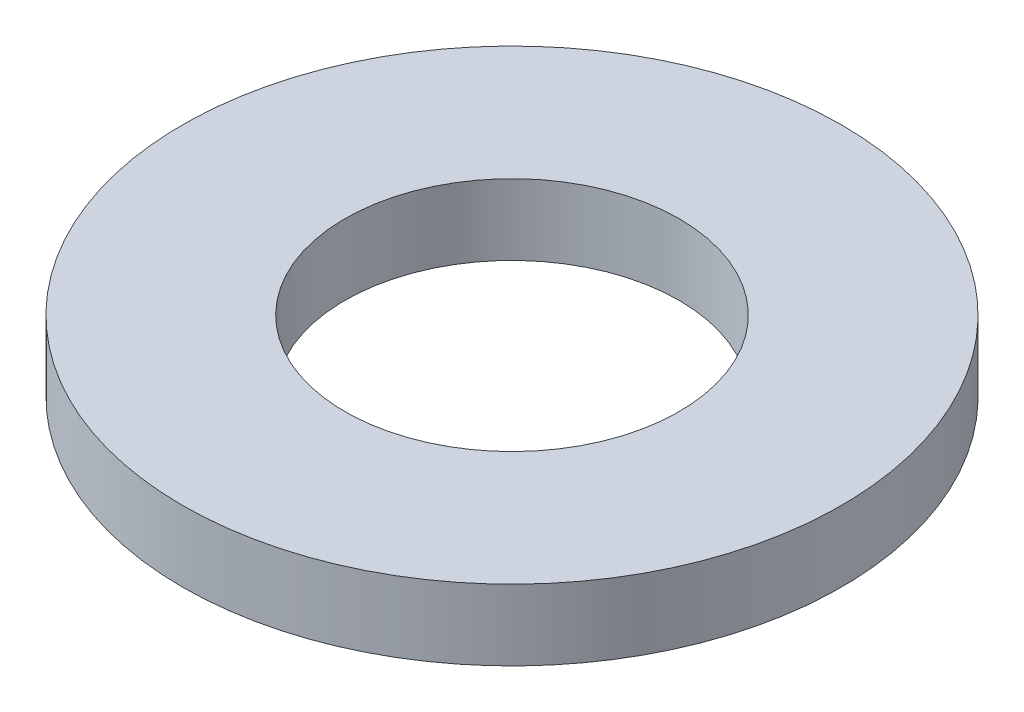
ISO-10303-21;
HEADER;
FILE_DESCRIPTION(('STEP AP214'),'2;1');
FILE_NAME('part.step','',(''),(''),'','','');
FILE_SCHEMA(('AUTOMOTIVE_DESIGN { 1 0 10303 214 1 1 1 1 }'));
ENDSEC;
DATA;
#1=APPLICATION_CONTEXT('core data for automotive mechanical design processes');
#2=APPLICATION_PROTOCOL_DEFINITION('international standard','automotive_design',2000,#1);
#3=PRODUCT_CONTEXT('',#1,'mechanical');
#4=PRODUCT('Part','Part','',(#3));
#5=PRODUCT_RELATED_PRODUCT_CATEGORY('part','',(#4));
#6=PRODUCT_DEFINITION_FORMATION('','',#4);
#7=PRODUCT_DEFINITION_CONTEXT('part definition',#1,'design');
#8=PRODUCT_DEFINITION('design','',#6,#7);
#9=PRODUCT_DEFINITION_SHAPE('','',#8);
#10=(LENGTH_UNIT() NAMED_UNIT(*) SI_UNIT(.MILLI.,.METRE.));
#11=(NAMED_UNIT(*) PLANE_ANGLE_UNIT() SI_UNIT($,.RADIAN.));
#12=(NAMED_UNIT(*) SI_UNIT($,.STERADIAN.) SOLID_ANGLE_UNIT());
#13=UNCERTAINTY_MEASURE_WITH_UNIT(LENGTH_MEASURE(1.E-05),#10,'distance_accuracy_value','');
#14=(GEOMETRIC_REPRESENTATION_CONTEXT(3) GLOBAL_UNCERTAINTY_ASSIGNED_CONTEXT((#13)) GLOBAL_UNIT_ASSIGNED_CONTEXT((#10,
#11,#12)) REPRESENTATION_CONTEXT('',''));
#15=CARTESIAN_POINT('',(0.,0.,0.));
#16=DIRECTION('',(0.,0.,1.));
#17=DIRECTION('',(1.,0.,0.));
#18=AXIS2_PLACEMENT_3D('',#15,#16,#17);
#19=CARTESIAN_POINT('',(0.,0.,0.));
#20=DIRECTION('',(0.,1.,0.));
#21=DIRECTION('',(0.,0.,1.));
#22=AXIS2_PLACEMENT_3D('',#19,#20,#21);
#23=PLANE('',#22);
#24=CARTESIAN_POINT('',(0.,0.,0.));
#25=DIRECTION('',(0.,-1.,0.));
#26=DIRECTION('',(0.,0.,-1.));
#27=AXIS2_PLACEMENT_3D('',#24,#25,#26);
#28=CIRCLE('',#27,2.03835);
#29=CARTESIAN_POINT('',(0.,0.,-2.03835));
#30=VERTEX_POINT('',#29);
#31=EDGE_CURVE('E27',#30,#30,#28,.F.);
#32=ORIENTED_EDGE('',*,*,#31,.T.);
#33=EDGE_LOOP('',(#32));
#34=FACE_BOUND('',#33,.T.);
#35=CARTESIAN_POINT('',(0.,0.,0.));
#36=DIRECTION('',(0.,-1.,0.));
#37=DIRECTION('',(0.,0.,-1.));
#38=AXIS2_PLACEMENT_3D('',#35,#36,#37);
#39=CIRCLE('',#38,4.01955);
#40=CARTESIAN_POINT('',(0.,0.,-4.01955));
#41=VERTEX_POINT('',#40);
#42=EDGE_CURVE('E18',#41,#41,#39,.F.);
#43=ORIENTED_EDGE('',*,*,#42,.F.);
#44=EDGE_LOOP('',(#43));
#45=FACE_BOUND('',#44,.T.);
#46=ADVANCED_FACE('F15',(#34,#45),#23,.F.);
#47=CARTESIAN_POINT('',(0.,0.8636,0.));
#48=DIRECTION('',(0.,-1.,0.));
#49=DIRECTION('',(0.,0.,-1.));
#50=AXIS2_PLACEMENT_3D('',#47,#48,#49);
#51=CYLINDRICAL_SURFACE('',#50,4.01955);
#52=ORIENTED_EDGE('',*,*,#42,.T.);
#53=EDGE_LOOP('',(#52));
#54=FACE_BOUND('',#53,.T.);
#55=CARTESIAN_POINT('',(0.,0.8636,0.));
#56=DIRECTION('',(0.,-1.,0.));
#57=DIRECTION('',(0.,0.,-1.));
#58=AXIS2_PLACEMENT_3D('',#55,#56,#57);
#59=CIRCLE('',#58,4.01955);
#60=CARTESIAN_POINT('',(0.,0.8636,-4.01955));
#61=VERTEX_POINT('',#60);
#62=EDGE_CURVE('E22',#61,#61,#59,.F.);
#63=ORIENTED_EDGE('',*,*,#62,.F.);
#64=EDGE_LOOP('',(#63));
#65=FACE_BOUND('',#64,.T.);
#66=ADVANCED_FACE('F35',(#54,#65),#51,.T.);
#67=CARTESIAN_POINT('',(0.,0.8636,0.));
#68=DIRECTION('',(0.,-1.,0.));
#69=DIRECTION('',(0.,0.,-1.));
#70=AXIS2_PLACEMENT_3D('',#67,#68,#69);
#71=CYLINDRICAL_SURFACE('',#70,2.03835);
#72=CARTESIAN_POINT('',(0.,0.8636,0.));
#73=DIRECTION('',(0.,-1.,0.));
#74=DIRECTION('',(0.,0.,-1.));
#75=AXIS2_PLACEMENT_3D('',#72,#73,#74);
#76=CIRCLE('',#75,2.03835);
#77=CARTESIAN_POINT('',(0.,0.8636,-2.03835));
#78=VERTEX_POINT('',#77);
#79=EDGE_CURVE('E10',#78,#78,#76,.T.);
#80=ORIENTED_EDGE('',*,*,#79,.F.);
#81=EDGE_LOOP('',(#80));
#82=FACE_BOUND('',#81,.T.);
#83=ORIENTED_EDGE('',*,*,#31,.F.);
#84=EDGE_LOOP('',(#83));
#85=FACE_BOUND('',#84,.T.);
#86=ADVANCED_FACE('F43',(#82,#85),#71,.F.);
#87=CARTESIAN_POINT('',(0.,0.8636,0.));
#88=DIRECTION('',(0.,1.,0.));
#89=DIRECTION('',(0.,0.,1.));
#90=AXIS2_PLACEMENT_3D('',#87,#88,#89);
#91=PLANE('',#90);
#92=ORIENTED_EDGE('',*,*,#79,.T.);
#93=EDGE_LOOP('',(#92));
#94=FACE_BOUND('',#93,.T.);
#95=ORIENTED_EDGE('',*,*,#62,.T.);
#96=EDGE_LOOP('',(#95));
#97=FACE_BOUND('',#96,.T.);
#98=ADVANCED_FACE('F44',(#94,#97),#91,.T.);
#99=CLOSED_SHELL('',(#46,#66,#86,#98));
#100=MANIFOLD_SOLID_BREP('B1',#99);
#101=ADVANCED_BREP_SHAPE_REPRESENTATION('',(#18,#100),#14);
#102=SHAPE_DEFINITION_REPRESENTATION(#9,#101);
ENDSEC;
END-ISO-10303-21;
